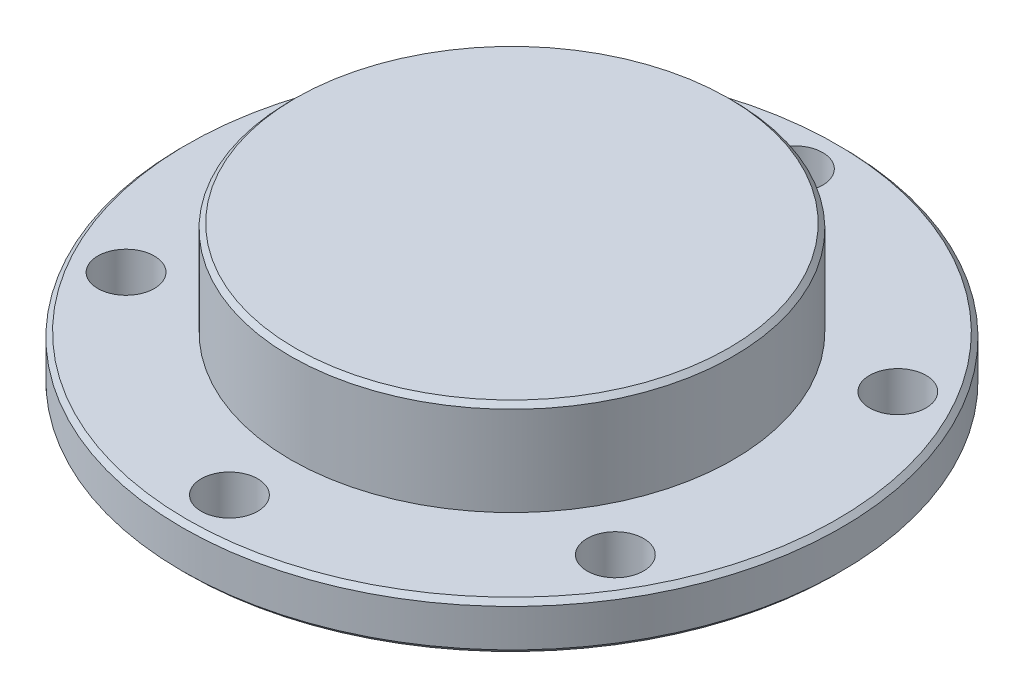
ISO-10303-21;
HEADER;
FILE_DESCRIPTION(('STEP AP214'),'2;1');
FILE_NAME('part.step','',(''),(''),'','','');
FILE_SCHEMA(('AUTOMOTIVE_DESIGN { 1 0 10303 214 1 1 1 1 }'));
ENDSEC;
DATA;
#1=APPLICATION_CONTEXT('core data for automotive mechanical design processes');
#2=APPLICATION_PROTOCOL_DEFINITION('international standard','automotive_design',2000,#1);
#3=PRODUCT_CONTEXT('',#1,'mechanical');
#4=PRODUCT('Part','Part','',(#3));
#5=PRODUCT_RELATED_PRODUCT_CATEGORY('part','',(#4));
#6=PRODUCT_DEFINITION_FORMATION('','',#4);
#7=PRODUCT_DEFINITION_CONTEXT('part definition',#1,'design');
#8=PRODUCT_DEFINITION('design','',#6,#7);
#9=PRODUCT_DEFINITION_SHAPE('','',#8);
#10=(LENGTH_UNIT() NAMED_UNIT(*) SI_UNIT(.MILLI.,.METRE.));
#11=(NAMED_UNIT(*) PLANE_ANGLE_UNIT() SI_UNIT($,.RADIAN.));
#12=(NAMED_UNIT(*) SI_UNIT($,.STERADIAN.) SOLID_ANGLE_UNIT());
#13=UNCERTAINTY_MEASURE_WITH_UNIT(LENGTH_MEASURE(1.E-05),#10,'distance_accuracy_value','');
#14=(GEOMETRIC_REPRESENTATION_CONTEXT(3) GLOBAL_UNCERTAINTY_ASSIGNED_CONTEXT((#13)) GLOBAL_UNIT_ASSIGNED_CONTEXT((#10,
#11,#12)) REPRESENTATION_CONTEXT('',''));
#15=CARTESIAN_POINT('',(0.,0.,0.));
#16=DIRECTION('',(0.,0.,1.));
#17=DIRECTION('',(1.,0.,0.));
#18=AXIS2_PLACEMENT_3D('',#15,#16,#17);
#19=CARTESIAN_POINT('',(0.,5.,0.));
#20=DIRECTION('',(0.,-1.,0.));
#21=DIRECTION('',(0.,0.,-1.));
#22=AXIS2_PLACEMENT_3D('',#19,#20,#21);
#23=CYLINDRICAL_SURFACE('',#22,35.);
#24=CARTESIAN_POINT('',(0.,0.5,0.));
#25=DIRECTION('',(0.,1.,0.));
#26=DIRECTION('',(0.,0.,1.));
#27=AXIS2_PLACEMENT_3D('',#24,#25,#26);
#28=CIRCLE('',#27,35.);
#29=CARTESIAN_POINT('',(0.,0.5,35.));
#30=VERTEX_POINT('',#29);
#31=EDGE_CURVE('E55',#30,#30,#28,.T.);
#32=ORIENTED_EDGE('',*,*,#31,.T.);
#33=EDGE_LOOP('',(#32));
#34=FACE_BOUND('',#33,.T.);
#35=CARTESIAN_POINT('',(0.,4.5,0.));
#36=DIRECTION('',(0.,1.,0.));
#37=DIRECTION('',(0.,0.,1.));
#38=AXIS2_PLACEMENT_3D('',#35,#36,#37);
#39=CIRCLE('',#38,35.);
#40=CARTESIAN_POINT('',(0.,4.5,35.));
#41=VERTEX_POINT('',#40);
#42=EDGE_CURVE('E60',#41,#41,#39,.F.);
#43=ORIENTED_EDGE('',*,*,#42,.T.);
#44=EDGE_LOOP('',(#43));
#45=FACE_BOUND('',#44,.T.);
#46=ADVANCED_FACE('F39',(#34,#45),#23,.T.);
#47=CARTESIAN_POINT('',(0.,5.,0.));
#48=DIRECTION('',(0.,1.,0.));
#49=DIRECTION('',(0.,0.,1.));
#50=AXIS2_PLACEMENT_3D('',#47,#48,#49);
#51=PLANE('',#50);
#52=CARTESIAN_POINT('',(0.,5.,0.));
#53=DIRECTION('',(0.,1.,0.));
#54=DIRECTION('',(0.,0.,1.));
#55=AXIS2_PLACEMENT_3D('',#52,#53,#54);
#56=CIRCLE('',#55,34.5);
#57=CARTESIAN_POINT('',(0.,5.,34.5));
#58=VERTEX_POINT('',#57);
#59=EDGE_CURVE('E51',#58,#58,#56,.T.);
#60=ORIENTED_EDGE('',*,*,#59,.T.);
#61=EDGE_LOOP('',(#60));
#62=FACE_BOUND('',#61,.T.);
#63=CARTESIAN_POINT('',(0.,5.,-30.));
#64=DIRECTION('',(0.,1.,0.));
#65=DIRECTION('',(0.,0.,1.));
#66=AXIS2_PLACEMENT_3D('',#63,#64,#65);
#67=CIRCLE('',#66,3.);
#68=CARTESIAN_POINT('',(0.,5.,-27.));
#69=VERTEX_POINT('',#68);
#70=EDGE_CURVE('E92',#69,#69,#67,.T.);
#71=ORIENTED_EDGE('',*,*,#70,.F.);
#72=EDGE_LOOP('',(#71));
#73=FACE_BOUND('',#72,.T.);
#74=CARTESIAN_POINT('',(-25.9807621135332,5.,-15.));
#75=DIRECTION('',(0.,1.,0.));
#76=DIRECTION('',(0.,0.,1.));
#77=AXIS2_PLACEMENT_3D('',#74,#75,#76);
#78=CIRCLE('',#77,3.00000000000036);
#79=CARTESIAN_POINT('',(-25.9807621135332,5.,-11.9999999999996));
#80=VERTEX_POINT('',#79);
#81=EDGE_CURVE('E101',#80,#80,#78,.T.);
#82=ORIENTED_EDGE('',*,*,#81,.F.);
#83=EDGE_LOOP('',(#82));
#84=FACE_BOUND('',#83,.T.);
#85=CARTESIAN_POINT('',(-25.9807621135332,5.,15.));
#86=DIRECTION('',(0.,1.,0.));
#87=DIRECTION('',(0.,0.,1.));
#88=AXIS2_PLACEMENT_3D('',#85,#86,#87);
#89=CIRCLE('',#88,3.00000000000028);
#90=CARTESIAN_POINT('',(-25.9807621135332,5.,18.0000000000003));
#91=VERTEX_POINT('',#90);
#92=EDGE_CURVE('E97',#91,#91,#89,.T.);
#93=ORIENTED_EDGE('',*,*,#92,.F.);
#94=EDGE_LOOP('',(#93));
#95=FACE_BOUND('',#94,.T.);
#96=CARTESIAN_POINT('',(0.,5.,30.));
#97=DIRECTION('',(0.,1.,0.));
#98=DIRECTION('',(0.,0.,1.));
#99=AXIS2_PLACEMENT_3D('',#96,#97,#98);
#100=CIRCLE('',#99,3.0000000000002);
#101=CARTESIAN_POINT('',(0.,5.,33.0000000000002));
#102=VERTEX_POINT('',#101);
#103=EDGE_CURVE('E100',#102,#102,#100,.T.);
#104=ORIENTED_EDGE('',*,*,#103,.F.);
#105=EDGE_LOOP('',(#104));
#106=FACE_BOUND('',#105,.T.);
#107=CARTESIAN_POINT('',(25.9807621135332,5.,15.));
#108=DIRECTION('',(0.,1.,0.));
#109=DIRECTION('',(0.,0.,1.));
#110=AXIS2_PLACEMENT_3D('',#107,#108,#109);
#111=CIRCLE('',#110,3.00000000000014);
#112=CARTESIAN_POINT('',(25.9807621135332,5.,18.0000000000001));
#113=VERTEX_POINT('',#112);
#114=EDGE_CURVE('E104',#113,#113,#111,.T.);
#115=ORIENTED_EDGE('',*,*,#114,.F.);
#116=EDGE_LOOP('',(#115));
#117=FACE_BOUND('',#116,.T.);
#118=CARTESIAN_POINT('',(25.9807621135332,5.,-15.));
#119=DIRECTION('',(0.,1.,0.));
#120=DIRECTION('',(0.,0.,1.));
#121=AXIS2_PLACEMENT_3D('',#118,#119,#120);
#122=CIRCLE('',#121,3.00000000000008);
#123=CARTESIAN_POINT('',(25.9807621135332,5.,-11.9999999999999));
#124=VERTEX_POINT('',#123);
#125=EDGE_CURVE('E107',#124,#124,#122,.T.);
#126=ORIENTED_EDGE('',*,*,#125,.F.);
#127=EDGE_LOOP('',(#126));
#128=FACE_BOUND('',#127,.T.);
#129=CARTESIAN_POINT('',(0.,5.,0.));
#130=DIRECTION('',(0.,1.,0.));
#131=DIRECTION('',(0.,0.,1.));
#132=AXIS2_PLACEMENT_3D('',#129,#130,#131);
#133=CIRCLE('',#132,23.5);
#134=CARTESIAN_POINT('',(0.,5.,23.5));
#135=VERTEX_POINT('',#134);
#136=EDGE_CURVE('E72',#135,#135,#133,.T.);
#137=ORIENTED_EDGE('',*,*,#136,.F.);
#138=EDGE_LOOP('',(#137));
#139=FACE_BOUND('',#138,.T.);
#140=ADVANCED_FACE('F118',(#62,#73,#84,#95,#106,#117,#128,#139),#51,.T.);
#141=CARTESIAN_POINT('',(0.,0.,0.));
#142=DIRECTION('',(0.,1.,0.));
#143=DIRECTION('',(0.,0.,1.));
#144=AXIS2_PLACEMENT_3D('',#141,#142,#143);
#145=PLANE('',#144);
#146=CARTESIAN_POINT('',(0.,0.,0.));
#147=DIRECTION('',(0.,1.,0.));
#148=DIRECTION('',(0.,0.,1.));
#149=AXIS2_PLACEMENT_3D('',#146,#147,#148);
#150=CIRCLE('',#149,20.5);
#151=CARTESIAN_POINT('',(0.,0.,20.5));
#152=VERTEX_POINT('',#151);
#153=EDGE_CURVE('E63',#152,#152,#150,.T.);
#154=ORIENTED_EDGE('',*,*,#153,.T.);
#155=EDGE_LOOP('',(#154));
#156=FACE_BOUND('',#155,.T.);
#157=CARTESIAN_POINT('',(0.,0.,0.));
#158=DIRECTION('',(0.,1.,0.));
#159=DIRECTION('',(0.,0.,1.));
#160=AXIS2_PLACEMENT_3D('',#157,#158,#159);
#161=CIRCLE('',#160,34.5);
#162=CARTESIAN_POINT('',(0.,0.,34.5));
#163=VERTEX_POINT('',#162);
#164=EDGE_CURVE('E66',#163,#163,#161,.F.);
#165=ORIENTED_EDGE('',*,*,#164,.T.);
#166=EDGE_LOOP('',(#165));
#167=FACE_BOUND('',#166,.T.);
#168=CARTESIAN_POINT('',(0.,0.,-30.));
#169=DIRECTION('',(0.,1.,0.));
#170=DIRECTION('',(0.,0.,1.));
#171=AXIS2_PLACEMENT_3D('',#168,#169,#170);
#172=CIRCLE('',#171,3.);
#173=CARTESIAN_POINT('',(0.,0.,-27.));
#174=VERTEX_POINT('',#173);
#175=EDGE_CURVE('E73',#174,#174,#172,.T.);
#176=ORIENTED_EDGE('',*,*,#175,.T.);
#177=EDGE_LOOP('',(#176));
#178=FACE_BOUND('',#177,.T.);
#179=CARTESIAN_POINT('',(-25.9807621135332,0.,-15.));
#180=DIRECTION('',(0.,1.,0.));
#181=DIRECTION('',(0.,0.,1.));
#182=AXIS2_PLACEMENT_3D('',#179,#180,#181);
#183=CIRCLE('',#182,3.00000000000036);
#184=CARTESIAN_POINT('',(-25.9807621135332,0.,-11.9999999999996));
#185=VERTEX_POINT('',#184);
#186=EDGE_CURVE('E77',#185,#185,#183,.T.);
#187=ORIENTED_EDGE('',*,*,#186,.T.);
#188=EDGE_LOOP('',(#187));
#189=FACE_BOUND('',#188,.T.);
#190=CARTESIAN_POINT('',(-25.9807621135332,0.,15.));
#191=DIRECTION('',(0.,1.,0.));
#192=DIRECTION('',(0.,0.,1.));
#193=AXIS2_PLACEMENT_3D('',#190,#191,#192);
#194=CIRCLE('',#193,3.00000000000028);
#195=CARTESIAN_POINT('',(-25.9807621135332,0.,18.0000000000003));
#196=VERTEX_POINT('',#195);
#197=EDGE_CURVE('E80',#196,#196,#194,.T.);
#198=ORIENTED_EDGE('',*,*,#197,.T.);
#199=EDGE_LOOP('',(#198));
#200=FACE_BOUND('',#199,.T.);
#201=CARTESIAN_POINT('',(0.,0.,30.));
#202=DIRECTION('',(0.,1.,0.));
#203=DIRECTION('',(0.,0.,1.));
#204=AXIS2_PLACEMENT_3D('',#201,#202,#203);
#205=CIRCLE('',#204,3.0000000000002);
#206=CARTESIAN_POINT('',(0.,0.,33.0000000000002));
#207=VERTEX_POINT('',#206);
#208=EDGE_CURVE('E83',#207,#207,#205,.T.);
#209=ORIENTED_EDGE('',*,*,#208,.T.);
#210=EDGE_LOOP('',(#209));
#211=FACE_BOUND('',#210,.T.);
#212=CARTESIAN_POINT('',(25.9807621135332,0.,15.));
#213=DIRECTION('',(0.,1.,0.));
#214=DIRECTION('',(0.,0.,1.));
#215=AXIS2_PLACEMENT_3D('',#212,#213,#214);
#216=CIRCLE('',#215,3.00000000000014);
#217=CARTESIAN_POINT('',(25.9807621135332,0.,18.0000000000001));
#218=VERTEX_POINT('',#217);
#219=EDGE_CURVE('E86',#218,#218,#216,.T.);
#220=ORIENTED_EDGE('',*,*,#219,.T.);
#221=EDGE_LOOP('',(#220));
#222=FACE_BOUND('',#221,.T.);
#223=CARTESIAN_POINT('',(25.9807621135332,0.,-15.));
#224=DIRECTION('',(0.,1.,0.));
#225=DIRECTION('',(0.,0.,1.));
#226=AXIS2_PLACEMENT_3D('',#223,#224,#225);
#227=CIRCLE('',#226,3.00000000000008);
#228=CARTESIAN_POINT('',(25.9807621135332,0.,-11.9999999999999));
#229=VERTEX_POINT('',#228);
#230=EDGE_CURVE('E89',#229,#229,#227,.T.);
#231=ORIENTED_EDGE('',*,*,#230,.T.);
#232=EDGE_LOOP('',(#231));
#233=FACE_BOUND('',#232,.T.);
#234=ADVANCED_FACE('F121',(#156,#167,#178,#189,#200,#211,#222,#233),#145,.F.);
#235=CARTESIAN_POINT('',(0.,15.,0.));
#236=DIRECTION('',(0.,-1.,0.));
#237=DIRECTION('',(0.,0.,-1.));
#238=AXIS2_PLACEMENT_3D('',#235,#236,#237);
#239=CYLINDRICAL_SURFACE('',#238,23.5);
#240=CARTESIAN_POINT('',(0.,14.5,0.));
#241=DIRECTION('',(0.,1.,0.));
#242=DIRECTION('',(0.,0.,1.));
#243=AXIS2_PLACEMENT_3D('',#240,#241,#242);
#244=CIRCLE('',#243,23.5);
#245=CARTESIAN_POINT('',(0.,14.5,23.5));
#246=VERTEX_POINT('',#245);
#247=EDGE_CURVE('E12',#246,#246,#244,.F.);
#248=ORIENTED_EDGE('',*,*,#247,.T.);
#249=EDGE_LOOP('',(#248));
#250=FACE_BOUND('',#249,.T.);
#251=ORIENTED_EDGE('',*,*,#136,.T.);
#252=EDGE_LOOP('',(#251));
#253=FACE_BOUND('',#252,.T.);
#254=ADVANCED_FACE('F136',(#250,#253),#239,.T.);
#255=CARTESIAN_POINT('',(0.,15.,0.));
#256=DIRECTION('',(0.,1.,0.));
#257=DIRECTION('',(0.,0.,1.));
#258=AXIS2_PLACEMENT_3D('',#255,#256,#257);
#259=PLANE('',#258);
#260=CARTESIAN_POINT('',(0.,15.,0.));
#261=DIRECTION('',(0.,1.,0.));
#262=DIRECTION('',(0.,0.,1.));
#263=AXIS2_PLACEMENT_3D('',#260,#261,#262);
#264=CIRCLE('',#263,23.);
#265=CARTESIAN_POINT('',(0.,15.,23.));
#266=VERTEX_POINT('',#265);
#267=EDGE_CURVE('E47',#266,#266,#264,.T.);
#268=ORIENTED_EDGE('',*,*,#267,.T.);
#269=EDGE_LOOP('',(#268));
#270=FACE_BOUND('',#269,.T.);
#271=ADVANCED_FACE('F138',(#270),#259,.T.);
#272=CARTESIAN_POINT('',(0.,14.,0.));
#273=DIRECTION('',(0.,-1.,0.));
#274=DIRECTION('',(0.,0.,-1.));
#275=AXIS2_PLACEMENT_3D('',#272,#273,#274);
#276=CYLINDRICAL_SURFACE('',#275,20.);
#277=CARTESIAN_POINT('',(0.,0.5,0.));
#278=DIRECTION('',(0.,1.,0.));
#279=DIRECTION('',(0.,0.,1.));
#280=AXIS2_PLACEMENT_3D('',#277,#278,#279);
#281=CIRCLE('',#280,20.);
#282=CARTESIAN_POINT('',(0.,0.5,20.));
#283=VERTEX_POINT('',#282);
#284=EDGE_CURVE('E69',#283,#283,#281,.F.);
#285=ORIENTED_EDGE('',*,*,#284,.T.);
#286=EDGE_LOOP('',(#285));
#287=FACE_BOUND('',#286,.T.);
#288=CARTESIAN_POINT('',(0.,14.,0.));
#289=DIRECTION('',(0.,-1.,0.));
#290=DIRECTION('',(0.,0.,-1.));
#291=AXIS2_PLACEMENT_3D('',#288,#289,#290);
#292=CIRCLE('',#291,20.);
#293=CARTESIAN_POINT('',(0.,14.,-20.));
#294=VERTEX_POINT('',#293);
#295=EDGE_CURVE('E76',#294,#294,#292,.T.);
#296=ORIENTED_EDGE('',*,*,#295,.F.);
#297=EDGE_LOOP('',(#296));
#298=FACE_BOUND('',#297,.T.);
#299=ADVANCED_FACE('F144',(#287,#298),#276,.F.);
#300=CARTESIAN_POINT('',(0.,14.,0.));
#301=DIRECTION('',(0.,-1.,0.));
#302=DIRECTION('',(0.,0.,-1.));
#303=AXIS2_PLACEMENT_3D('',#300,#301,#302);
#304=PLANE('',#303);
#305=ORIENTED_EDGE('',*,*,#295,.T.);
#306=EDGE_LOOP('',(#305));
#307=FACE_BOUND('',#306,.T.);
#308=ADVANCED_FACE('F210',(#307),#304,.T.);
#309=CARTESIAN_POINT('',(25.9807621135332,-9.,-15.));
#310=DIRECTION('',(0.,1.,0.));
#311=DIRECTION('',(0.,0.,1.));
#312=AXIS2_PLACEMENT_3D('',#309,#310,#311);
#313=CYLINDRICAL_SURFACE('',#312,3.00000000000008);
#314=ORIENTED_EDGE('',*,*,#125,.T.);
#315=EDGE_LOOP('',(#314));
#316=FACE_BOUND('',#315,.T.);
#317=ORIENTED_EDGE('',*,*,#230,.F.);
#318=EDGE_LOOP('',(#317));
#319=FACE_BOUND('',#318,.T.);
#320=ADVANCED_FACE('F249',(#316,#319),#313,.F.);
#321=CARTESIAN_POINT('',(25.9807621135332,-9.,15.));
#322=DIRECTION('',(0.,1.,0.));
#323=DIRECTION('',(0.,0.,1.));
#324=AXIS2_PLACEMENT_3D('',#321,#322,#323);
#325=CYLINDRICAL_SURFACE('',#324,3.00000000000014);
#326=ORIENTED_EDGE('',*,*,#114,.T.);
#327=EDGE_LOOP('',(#326));
#328=FACE_BOUND('',#327,.T.);
#329=ORIENTED_EDGE('',*,*,#219,.F.);
#330=EDGE_LOOP('',(#329));
#331=FACE_BOUND('',#330,.T.);
#332=ADVANCED_FACE('F258',(#328,#331),#325,.F.);
#333=CARTESIAN_POINT('',(0.,-9.,30.));
#334=DIRECTION('',(0.,1.,0.));
#335=DIRECTION('',(0.,0.,1.));
#336=AXIS2_PLACEMENT_3D('',#333,#334,#335);
#337=CYLINDRICAL_SURFACE('',#336,3.0000000000002);
#338=ORIENTED_EDGE('',*,*,#103,.T.);
#339=EDGE_LOOP('',(#338));
#340=FACE_BOUND('',#339,.T.);
#341=ORIENTED_EDGE('',*,*,#208,.F.);
#342=EDGE_LOOP('',(#341));
#343=FACE_BOUND('',#342,.T.);
#344=ADVANCED_FACE('F267',(#340,#343),#337,.F.);
#345=CARTESIAN_POINT('',(-25.9807621135332,-9.,15.));
#346=DIRECTION('',(0.,1.,0.));
#347=DIRECTION('',(0.,0.,1.));
#348=AXIS2_PLACEMENT_3D('',#345,#346,#347);
#349=CYLINDRICAL_SURFACE('',#348,3.00000000000028);
#350=ORIENTED_EDGE('',*,*,#92,.T.);
#351=EDGE_LOOP('',(#350));
#352=FACE_BOUND('',#351,.T.);
#353=ORIENTED_EDGE('',*,*,#197,.F.);
#354=EDGE_LOOP('',(#353));
#355=FACE_BOUND('',#354,.T.);
#356=ADVANCED_FACE('F276',(#352,#355),#349,.F.);
#357=CARTESIAN_POINT('',(-25.9807621135332,-9.,-15.));
#358=DIRECTION('',(0.,1.,0.));
#359=DIRECTION('',(0.,0.,1.));
#360=AXIS2_PLACEMENT_3D('',#357,#358,#359);
#361=CYLINDRICAL_SURFACE('',#360,3.00000000000036);
#362=ORIENTED_EDGE('',*,*,#81,.T.);
#363=EDGE_LOOP('',(#362));
#364=FACE_BOUND('',#363,.T.);
#365=ORIENTED_EDGE('',*,*,#186,.F.);
#366=EDGE_LOOP('',(#365));
#367=FACE_BOUND('',#366,.T.);
#368=ADVANCED_FACE('F285',(#364,#367),#361,.F.);
#369=CARTESIAN_POINT('',(0.,-9.,-30.));
#370=DIRECTION('',(0.,1.,0.));
#371=DIRECTION('',(0.,0.,1.));
#372=AXIS2_PLACEMENT_3D('',#369,#370,#371);
#373=CYLINDRICAL_SURFACE('',#372,3.);
#374=ORIENTED_EDGE('',*,*,#70,.T.);
#375=EDGE_LOOP('',(#374));
#376=FACE_BOUND('',#375,.T.);
#377=ORIENTED_EDGE('',*,*,#175,.F.);
#378=EDGE_LOOP('',(#377));
#379=FACE_BOUND('',#378,.T.);
#380=ADVANCED_FACE('F115',(#376,#379),#373,.F.);
#381=CARTESIAN_POINT('',(0.,0.5,0.));
#382=DIRECTION('',(0.,-1.,0.));
#383=DIRECTION('',(0.,0.,-1.));
#384=AXIS2_PLACEMENT_3D('',#381,#382,#383);
#385=CONICAL_SURFACE('',#384,20.,0.785398163397448);
#386=ORIENTED_EDGE('',*,*,#153,.F.);
#387=EDGE_LOOP('',(#386));
#388=FACE_BOUND('',#387,.T.);
#389=ORIENTED_EDGE('',*,*,#284,.F.);
#390=EDGE_LOOP('',(#389));
#391=FACE_BOUND('',#390,.T.);
#392=ADVANCED_FACE('F157',(#388,#391),#385,.F.);
#393=CARTESIAN_POINT('',(0.,0.5,0.));
#394=DIRECTION('',(0.,1.,0.));
#395=DIRECTION('',(0.,0.,1.));
#396=AXIS2_PLACEMENT_3D('',#393,#394,#395);
#397=CONICAL_SURFACE('',#396,35.,0.785398163397449);
#398=ORIENTED_EDGE('',*,*,#164,.F.);
#399=EDGE_LOOP('',(#398));
#400=FACE_BOUND('',#399,.T.);
#401=ORIENTED_EDGE('',*,*,#31,.F.);
#402=EDGE_LOOP('',(#401));
#403=FACE_BOUND('',#402,.T.);
#404=ADVANCED_FACE('F163',(#400,#403),#397,.T.);
#405=CARTESIAN_POINT('',(0.,5.,0.));
#406=DIRECTION('',(0.,-1.,0.));
#407=DIRECTION('',(0.,0.,-1.));
#408=AXIS2_PLACEMENT_3D('',#405,#406,#407);
#409=CONICAL_SURFACE('',#408,34.5,0.785398163397449);
#410=ORIENTED_EDGE('',*,*,#42,.F.);
#411=EDGE_LOOP('',(#410));
#412=FACE_BOUND('',#411,.T.);
#413=ORIENTED_EDGE('',*,*,#59,.F.);
#414=EDGE_LOOP('',(#413));
#415=FACE_BOUND('',#414,.T.);
#416=ADVANCED_FACE('F169',(#412,#415),#409,.T.);
#417=CARTESIAN_POINT('',(0.,15.,0.));
#418=DIRECTION('',(0.,-1.,0.));
#419=DIRECTION('',(0.,0.,-1.));
#420=AXIS2_PLACEMENT_3D('',#417,#418,#419);
#421=CONICAL_SURFACE('',#420,23.,0.785398163397448);
#422=ORIENTED_EDGE('',*,*,#247,.F.);
#423=EDGE_LOOP('',(#422));
#424=FACE_BOUND('',#423,.T.);
#425=ORIENTED_EDGE('',*,*,#267,.F.);
#426=EDGE_LOOP('',(#425));
#427=FACE_BOUND('',#426,.T.);
#428=ADVANCED_FACE('F42',(#424,#427),#421,.T.);
#429=CLOSED_SHELL('',(#46,#140,#234,#254,#271,#299,#308,#320,#332,#344,#356,#368,#380,#392,#404,
#416,#428));
#430=MANIFOLD_SOLID_BREP('B2',#429);
#431=ADVANCED_BREP_SHAPE_REPRESENTATION('',(#18,#430),#14);
#432=SHAPE_DEFINITION_REPRESENTATION(#9,#431);
ENDSEC;
END-ISO-10303-21;
